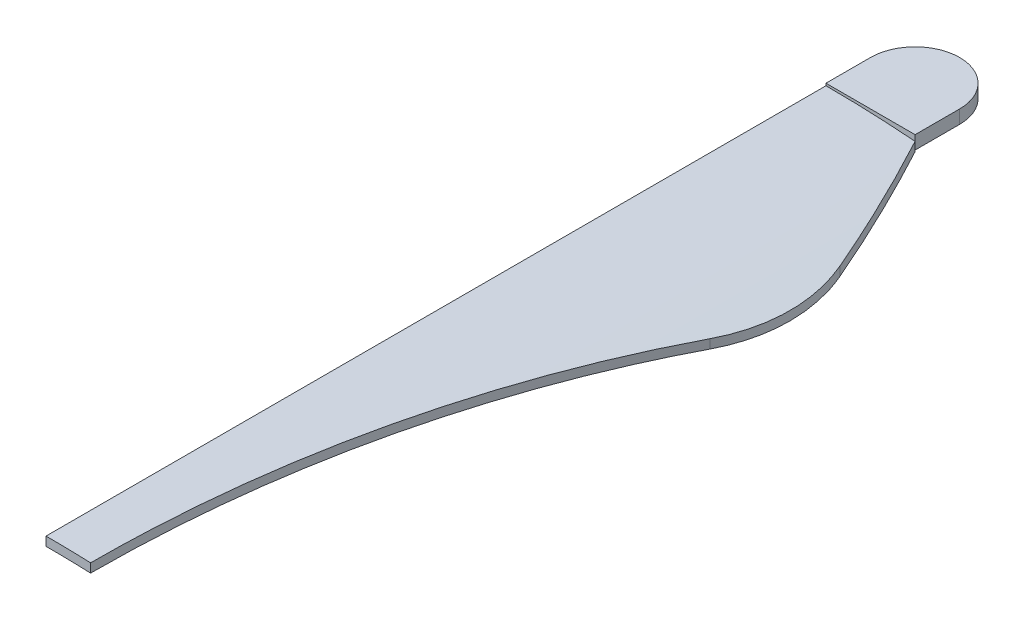
ISO-10303-21;
HEADER;
FILE_DESCRIPTION(('STEP AP214'),'2;1');
FILE_NAME('part.step','',(''),(''),'','','');
FILE_SCHEMA(('AUTOMOTIVE_DESIGN { 1 0 10303 214 1 1 1 1 }'));
ENDSEC;
DATA;
#1=APPLICATION_CONTEXT('core data for automotive mechanical design processes');
#2=APPLICATION_PROTOCOL_DEFINITION('international standard','automotive_design',2000,#1);
#3=PRODUCT_CONTEXT('',#1,'mechanical');
#4=PRODUCT('Part','Part','',(#3));
#5=PRODUCT_RELATED_PRODUCT_CATEGORY('part','',(#4));
#6=PRODUCT_DEFINITION_FORMATION('','',#4);
#7=PRODUCT_DEFINITION_CONTEXT('part definition',#1,'design');
#8=PRODUCT_DEFINITION('design','',#6,#7);
#9=PRODUCT_DEFINITION_SHAPE('','',#8);
#10=(LENGTH_UNIT() NAMED_UNIT(*) SI_UNIT(.MILLI.,.METRE.));
#11=(NAMED_UNIT(*) PLANE_ANGLE_UNIT() SI_UNIT($,.RADIAN.));
#12=(NAMED_UNIT(*) SI_UNIT($,.STERADIAN.) SOLID_ANGLE_UNIT());
#13=UNCERTAINTY_MEASURE_WITH_UNIT(LENGTH_MEASURE(1.E-05),#10,'distance_accuracy_value','');
#14=(GEOMETRIC_REPRESENTATION_CONTEXT(3) GLOBAL_UNCERTAINTY_ASSIGNED_CONTEXT((#13)) GLOBAL_UNIT_ASSIGNED_CONTEXT((#10,
#11,#12)) REPRESENTATION_CONTEXT('',''));
#15=CARTESIAN_POINT('',(0.,0.,0.));
#16=DIRECTION('',(0.,0.,1.));
#17=DIRECTION('',(1.,0.,0.));
#18=AXIS2_PLACEMENT_3D('',#15,#16,#17);
#19=CARTESIAN_POINT('',(0.,-500.,0.));
#20=DIRECTION('',(0.,0.,-1.));
#21=DIRECTION('',(-1.,0.,0.));
#22=AXIS2_PLACEMENT_3D('',#19,#20,#21);
#23=PLANE('',#22);
#24=DIRECTION('',(1.,0.,0.));
#25=VECTOR('',#24,1.);
#26=CARTESIAN_POINT('',(40.,-5.,0.));
#27=LINE('',#26,#25);
#28=CARTESIAN_POINT('',(31.4801524773943,-5.,0.));
#29=VERTEX_POINT('',#28);
#30=CARTESIAN_POINT('',(40.,-5.,0.));
#31=VERTEX_POINT('',#30);
#32=EDGE_CURVE('E146',#29,#31,#27,.T.);
#33=ORIENTED_EDGE('',*,*,#32,.T.);
#34=DIRECTION('',(0.,1.,0.));
#35=VECTOR('',#34,1.);
#36=CARTESIAN_POINT('',(40.,-10.4941266950926,0.));
#37=LINE('',#36,#35);
#38=CARTESIAN_POINT('',(40.,-5.61553422462802,0.));
#39=VERTEX_POINT('',#38);
#40=EDGE_CURVE('E61',#39,#31,#37,.T.);
#41=ORIENTED_EDGE('',*,*,#40,.F.);
#42=CARTESIAN_POINT('',(0.,-500.,0.));
#43=DIRECTION('',(0.,0.,-1.));
#44=DIRECTION('',(-1.,0.,0.));
#45=AXIS2_PLACEMENT_3D('',#42,#43,#44);
#46=CIRCLE('',#45,496.);
#47=EDGE_CURVE('E225',#29,#39,#46,.T.);
#48=ORIENTED_EDGE('',*,*,#47,.F.);
#49=EDGE_LOOP('',(#33,#41,#48));
#50=FACE_BOUND('',#49,.T.);
#51=ADVANCED_FACE('F40',(#50),#23,.T.);
#52=CARTESIAN_POINT('',(0.,-500.,350.));
#53=DIRECTION('',(0.,0.,-1.));
#54=DIRECTION('',(-1.,0.,0.));
#55=AXIS2_PLACEMENT_3D('',#52,#53,#54);
#56=CYLINDRICAL_SURFACE('',#55,500.);
#57=CARTESIAN_POINT('',(39.9999999999999,-1.60256822491556,0.));
#58=CARTESIAN_POINT('',(42.6357460425873,-1.81413813341256,5.06786090540559));
#59=CARTESIAN_POINT('',(45.2073257510757,-2.04153684561505,10.1683974444305));
#60=CARTESIAN_POINT('',(50.2191020421145,-2.52197755026612,20.4283459968078));
#61=CARTESIAN_POINT('',(52.6593822932445,-2.77500290894377,25.5877179154173));
#62=CARTESIAN_POINT('',(57.4089084844292,-3.30097013261121,35.9653974094959));
#63=CARTESIAN_POINT('',(59.7181546634356,-3.57391196127955,41.1837048774701));
#64=CARTESIAN_POINT('',(64.2057660714829,-4.13436588078955,51.6795187009418));
#65=CARTESIAN_POINT('',(66.3840458721034,-4.42188726115771,56.9570610881777));
#66=CARTESIAN_POINT('',(68.4954251698396,-4.71384359059367,62.2609771605887));
#67=B_SPLINE_CURVE_WITH_KNOTS('',3,(#57,#58,#59,#60,#61,#62,#63,#64,#65,#66),.UNSPECIFIED.,.F.,
.F.,(4,2,2,2,4),(0.,17.1481298217255,34.2851995945112,51.4222381153875,68.570336363611),.UNSPECIFIED.);
#68=CARTESIAN_POINT('',(40.,-1.60256822491551,0.));
#69=VERTEX_POINT('',#68);
#70=CARTESIAN_POINT('',(68.4954251698395,-4.71384359059368,62.2609771605888));
#71=VERTEX_POINT('',#70);
#72=EDGE_CURVE('E255',#69,#71,#67,.T.);
#73=ORIENTED_EDGE('',*,*,#72,.F.);
#74=CARTESIAN_POINT('',(0.,-500.,0.));
#75=DIRECTION('',(0.,0.,1.));
#76=DIRECTION('',(-1.,0.,0.));
#77=AXIS2_PLACEMENT_3D('',#74,#75,#76);
#78=CIRCLE('',#77,500.);
#79=CARTESIAN_POINT('',(0.,0.,0.));
#80=VERTEX_POINT('',#79);
#81=EDGE_CURVE('E144',#69,#80,#78,.T.);
#82=ORIENTED_EDGE('',*,*,#81,.T.);
#83=DIRECTION('',(0.,0.,-1.));
#84=VECTOR('',#83,1.);
#85=CARTESIAN_POINT('',(0.,0.,350.));
#86=LINE('',#85,#84);
#87=CARTESIAN_POINT('',(0.,0.,350.));
#88=VERTEX_POINT('',#87);
#89=EDGE_CURVE('E134',#88,#80,#86,.T.);
#90=ORIENTED_EDGE('',*,*,#89,.F.);
#91=CARTESIAN_POINT('',(0.,-500.,350.));
#92=DIRECTION('',(0.,0.,1.));
#93=DIRECTION('',(-1.,0.,0.));
#94=AXIS2_PLACEMENT_3D('',#91,#92,#93);
#95=CIRCLE('',#94,500.);
#96=CARTESIAN_POINT('',(20.,-0.400160128128216,350.));
#97=VERTEX_POINT('',#96);
#98=EDGE_CURVE('E118',#97,#88,#95,.T.);
#99=ORIENTED_EDGE('',*,*,#98,.F.);
#100=CARTESIAN_POINT('',(67.6518018777058,-4.5979070465087,119.770992366412));
#101=CARTESIAN_POINT('',(66.0370849459635,-4.37742049336618,123.504605553351));
#102=CARTESIAN_POINT('',(64.461386299886,-4.17026808924305,127.255855869261));
#103=CARTESIAN_POINT('',(61.3888563629122,-3.7804809047113,134.7917508133));
#104=CARTESIAN_POINT('',(59.8920245027497,-3.59784594731921,138.576395200159));
#105=CARTESIAN_POINT('',(56.9780745232113,-3.25494444282596,146.177150731898));
#106=CARTESIAN_POINT('',(55.5609542745152,-3.09467729804834,149.993261033112));
#107=CARTESIAN_POINT('',(52.8071465339527,-2.79448646327352,157.655115206395));
#108=CARTESIAN_POINT('',(51.470459187741,-2.65456281011532,161.500859132114));
#109=CARTESIAN_POINT('',(47.580958186373,-2.26226145087469,173.08319772298));
#110=CARTESIAN_POINT('',(45.1498118950002,-2.03748042025413,180.862013594122));
#111=CARTESIAN_POINT('',(40.6172071547249,-1.6472991581043,196.516127006125));
#112=CARTESIAN_POINT('',(38.5157467448533,-1.48189857337307,204.391423972816));
#113=CARTESIAN_POINT('',(34.6790029361022,-1.20043408606813,220.090977557488));
#114=CARTESIAN_POINT('',(32.93813497451,-1.08358417173421,227.913850138908));
#115=CARTESIAN_POINT('',(30.5710393587079,-0.934842649461949,239.697165520769));
#116=CARTESIAN_POINT('',(29.8226778062668,-0.889682801753163,243.633299450563));
#117=CARTESIAN_POINT('',(28.407666924401,-0.807143331468977,251.520284163316));
#118=CARTESIAN_POINT('',(27.7410157127766,-0.769763529666169,255.471134605118));
#119=CARTESIAN_POINT('',(26.4900799146696,-0.701825123115239,263.383570734695));
#120=CARTESIAN_POINT('',(25.9057483212698,-0.671262619625212,267.345148968435));
#121=CARTESIAN_POINT('',(24.8192616002311,-0.616079320780989,275.27951249314));
#122=CARTESIAN_POINT('',(24.317104598798,-0.591458389937422,279.252297526459));
#123=CARTESIAN_POINT('',(23.3952252503751,-0.547423345613465,287.206977529526));
#124=CARTESIAN_POINT('',(22.9754933240406,-0.528008626977275,291.188871386176));
#125=CARTESIAN_POINT('',(22.2185823317236,-0.493765621521082,299.160423648141));
#126=CARTESIAN_POINT('',(21.8814011913826,-0.478937219452401,303.15008185581));
#127=CARTESIAN_POINT('',(21.3219070130397,-0.454761056567123,310.701189281939));
#128=CARTESIAN_POINT('',(21.0910885794551,-0.444992580773984,314.262009756518));
#129=CARTESIAN_POINT('',(20.695234245587,-0.428437246506293,321.386781978632));
#130=CARTESIAN_POINT('',(20.530188482962,-0.421649941001909,324.950733176346));
#131=CARTESIAN_POINT('',(20.2653844701422,-0.410835956903092,332.094680365448));
#132=CARTESIAN_POINT('',(20.1658777242074,-0.406819910164284,335.674685692101));
#133=CARTESIAN_POINT('',(20.0331785107647,-0.401488832846971,342.836460396845));
#134=CARTESIAN_POINT('',(19.9999959191106,-0.400174204516471,346.418229958226));
#135=CARTESIAN_POINT('',(19.9999999999999,-0.400160128128171,350.));
#136=B_SPLINE_CURVE_WITH_KNOTS('',3,(#100,#101,#102,#103,#104,#105,#106,#107,#108,#109,#110,
#111,#112,#113,#114,#115,#116,#117,#118,#119,#120,#121,#122,#123,#124,#125,#126,#127,#128,#129,
#130,#131,#132,#133,#134,#135),.UNSPECIFIED.,.F.,.F.,(4,2,2,2,2,2,2,2,2,2,2,2,2,2,2,2,2,4),(0.,
12.2210952857972,24.4421023467491,36.6627827952017,48.8834853731911,73.3341618966582,
97.7846929821792,121.822310836496,133.842299678847,145.862011588393,157.874831825094,
169.887378100107,181.898527463912,193.909374977305,204.613700538205,215.316420425026,
226.059976059254,236.805131320087),.UNSPECIFIED.);
#137=CARTESIAN_POINT('',(67.6518018777056,-4.59790704650864,119.770992366412));
#138=VERTEX_POINT('',#137);
#139=EDGE_CURVE('E186',#138,#97,#136,.T.);
#140=ORIENTED_EDGE('',*,*,#139,.F.);
#141=CARTESIAN_POINT('',(68.4954251698395,-4.71384359059368,62.2609771605888));
#142=CARTESIAN_POINT('',(68.8813526547042,-4.76721986651159,63.2304078278076));
#143=CARTESIAN_POINT('',(69.2470690441918,-4.81825182775029,64.2080150537457));
#144=CARTESIAN_POINT('',(69.9374691789008,-4.91528690050184,66.1778617309593));
#145=CARTESIAN_POINT('',(70.2621527953763,-4.96128999623586,67.1701012281349));
#146=CARTESIAN_POINT('',(70.8698816640133,-5.04792779953621,69.1675089928595));
#147=CARTESIAN_POINT('',(71.1529259344575,-5.0885623805285,70.1726775646259));
#148=CARTESIAN_POINT('',(71.6768459723733,-5.16416873864837,72.1941535478737));
#149=CARTESIAN_POINT('',(71.9177218423888,-5.19914052954655,73.2104609322617));
#150=CARTESIAN_POINT('',(72.3569522997522,-5.26318034894725,75.2528772653591));
#151=CARTESIAN_POINT('',(72.555288099848,-5.29224576868342,76.2789903365136));
#152=CARTESIAN_POINT('',(72.9089481217826,-5.34424369514204,78.3388549608326));
#153=CARTESIAN_POINT('',(73.0642683514128,-5.36717563261874,79.372607213843));
#154=CARTESIAN_POINT('',(73.3315593594778,-5.40673209575221,81.4456635497993));
#155=CARTESIAN_POINT('',(73.4435366406308,-5.423357567557,82.4849667761976));
#156=CARTESIAN_POINT('',(73.6239704957875,-5.45018522654888,84.5675189428526));
#157=CARTESIAN_POINT('',(73.6924232517163,-5.46038685021998,85.6107682211935));
#158=CARTESIAN_POINT('',(73.7856985657591,-5.47429499066302,87.7000708618577));
#159=CARTESIAN_POINT('',(73.8104871977141,-5.47799645693472,88.746125772686));
#160=CARTESIAN_POINT('',(73.8162829135154,-5.47886153836405,90.8383596058836));
#161=CARTESIAN_POINT('',(73.7972899943799,-5.47602515307641,91.8845385282613));
#162=CARTESIAN_POINT('',(73.7155516693965,-5.4638343376138,93.9753314229862));
#163=CARTESIAN_POINT('',(73.6527985887629,-5.45447876408466,95.0199450886031));
#164=CARTESIAN_POINT('',(73.4836586995042,-5.429318286706,97.1054632869783));
#165=CARTESIAN_POINT('',(73.377275733497,-5.41351395081942,98.1463681382419));
#166=CARTESIAN_POINT('',(73.121290701173,-5.37560356119604,100.220983772967));
#167=CARTESIAN_POINT('',(72.9717604537734,-5.35350798007919,101.254703611539));
#168=CARTESIAN_POINT('',(72.6297100845391,-5.3031685082672,103.314756186561));
#169=CARTESIAN_POINT('',(72.4371940190229,-5.27492519770341,104.341089610597));
#170=CARTESIAN_POINT('',(72.009603113883,-5.21250651487484,106.384285206702));
#171=CARTESIAN_POINT('',(71.7745433343552,-5.17833324193993,107.401150596868));
#172=CARTESIAN_POINT('',(71.2622801055465,-5.10429945554509,109.423891972996));
#173=CARTESIAN_POINT('',(70.9850816945158,-5.06443962202634,110.429769257348));
#174=CARTESIAN_POINT('',(70.475355039167,-4.99164655656949,112.139386764415));
#175=CARTESIAN_POINT('',(70.2531334333658,-4.96004965418397,112.846276908397));
#176=CARTESIAN_POINT('',(69.7879296332485,-4.89425366517972,114.252906557665));
#177=CARTESIAN_POINT('',(69.544952061989,-4.86005515821123,114.952647616622));
#178=CARTESIAN_POINT('',(69.0387626899559,-4.78922211498776,116.343570589964));
#179=CARTESIAN_POINT('',(68.7755786954614,-4.75259093541692,117.034762798996));
#180=CARTESIAN_POINT('',(68.2288737961155,-4.67697744582368,118.409101426766));
#181=CARTESIAN_POINT('',(67.9453484844614,-4.63799462662807,119.092246064506));
#182=CARTESIAN_POINT('',(67.6518018777057,-4.5979070465086,119.770992366412));
#183=B_SPLINE_CURVE_WITH_KNOTS('',3,(#141,#142,#143,#144,#145,#146,#147,#148,#149,#150,#151,
#152,#153,#154,#155,#156,#157,#158,#159,#160,#161,#162,#163,#164,#165,#166,#167,#168,#169,#170,
#171,#172,#173,#174,#175,#176,#177,#178,#179,#180,#181,#182),.UNSPECIFIED.,.F.,.F.,(4,2,2,2,2,2,
2,2,2,2,2,2,2,2,2,2,2,2,2,2,4),(0.,3.13414092176516,6.26829167708911,9.40251631343516,
12.5367333279561,15.6723316902393,18.8082209651081,21.9436395817416,25.0793332068177,
28.2174621307829,31.3555912684714,34.4942709189253,37.6326741955649,40.7658834204964,
43.8987971077807,47.0306039329196,50.1620366017688,52.3867415464265,54.6109522595349,
56.8321552583403,59.053840926699),.UNSPECIFIED.);
#184=EDGE_CURVE('E85',#71,#138,#183,.T.);
#185=ORIENTED_EDGE('',*,*,#184,.F.);
#186=EDGE_LOOP('',(#73,#82,#90,#99,#140,#185));
#187=FACE_BOUND('',#186,.T.);
#188=ADVANCED_FACE('F42',(#187),#56,.T.);
#189=CARTESIAN_POINT('',(0.,-500.,350.));
#190=DIRECTION('',(0.,0.,-1.));
#191=DIRECTION('',(-1.,0.,0.));
#192=AXIS2_PLACEMENT_3D('',#189,#190,#191);
#193=CYLINDRICAL_SURFACE('',#192,496.);
#194=CARTESIAN_POINT('',(68.4954251698395,-8.75222470651033,62.2609771605887));
#195=CARTESIAN_POINT('',(66.3840552169472,-8.45786953680281,56.9570847359306));
#196=CARTESIAN_POINT('',(64.2057839222447,-8.16798997181662,51.6795618166731));
#197=CARTESIAN_POINT('',(59.7181859248119,-7.60294639974288,41.1837766282945));
#198=CARTESIAN_POINT('',(57.4089446782788,-7.32777301965596,35.9654783240952));
#199=CARTESIAN_POINT('',(52.6594219702867,-6.79751147977523,25.5878027781962));
#200=CARTESIAN_POINT('',(50.2191402659362,-6.54242335721284,20.4284256457319));
#201=CARTESIAN_POINT('',(45.2073520786617,-6.05807059060418,10.1684499419972));
#202=CARTESIAN_POINT('',(42.635761896933,-5.82882272394352,5.06789146715783));
#203=CARTESIAN_POINT('',(39.9999999999999,-5.61553422462799,0.));
#204=B_SPLINE_CURVE_WITH_KNOTS('',3,(#194,#195,#196,#197,#198,#199,#200,#201,#202,#203),
.UNSPECIFIED.,.F.,.F.,(4,2,2,2,4),(0.,17.1483914681556,34.2857197586618,51.4230798153479,
68.5715033764119),.UNSPECIFIED.);
#205=CARTESIAN_POINT('',(68.4954251698395,-8.75222470651033,62.2609771605888));
#206=VERTEX_POINT('',#205);
#207=EDGE_CURVE('E236',#206,#39,#204,.T.);
#208=ORIENTED_EDGE('',*,*,#207,.F.);
#209=CARTESIAN_POINT('',(67.6518018777057,-8.63533531327299,119.770992366412));
#210=CARTESIAN_POINT('',(68.0660280862278,-8.69237088828384,118.813230429485));
#211=CARTESIAN_POINT('',(68.4602897956822,-8.74718303744311,117.846699927438));
#212=CARTESIAN_POINT('',(69.2082240563466,-8.85199230196143,115.897799328753));
#213=CARTESIAN_POINT('',(69.561896464947,-8.90198940040279,114.915429176476));
#214=CARTESIAN_POINT('',(70.2279986221066,-8.9968013387929,112.936525111016));
#215=CARTESIAN_POINT('',(70.5404271842519,-9.04161602966074,111.939990791303));
#216=CARTESIAN_POINT('',(71.1234563667044,-9.12573830343804,109.934532978658));
#217=CARTESIAN_POINT('',(71.3940570917175,-9.16504590013315,108.925609516747));
#218=CARTESIAN_POINT('',(71.8930502473569,-9.23788560872386,106.896643571432));
#219=CARTESIAN_POINT('',(72.1214218286755,-9.27141486719455,105.876595857565));
#220=CARTESIAN_POINT('',(72.5353836343997,-9.33243238243747,103.827577895646));
#221=CARTESIAN_POINT('',(72.7209698913145,-9.35992007896354,102.798606829303));
#222=CARTESIAN_POINT('',(73.0489591345837,-9.40864555201281,100.733817226693));
#223=CARTESIAN_POINT('',(73.1913686459245,-9.42988427288372,99.6979997492726));
#224=CARTESIAN_POINT('',(73.4327831156415,-9.46596319273566,97.6211156935224));
#225=CARTESIAN_POINT('',(73.5317842681909,-9.48080283067537,96.5800486630283));
#226=CARTESIAN_POINT('',(73.6862378825377,-9.50398120474133,94.4937716303521));
#227=CARTESIAN_POINT('',(73.7416551343486,-9.51231468471894,93.4485589626888));
#228=CARTESIAN_POINT('',(73.8087023995853,-9.52239949135658,91.356698445093));
#229=CARTESIAN_POINT('',(73.8203324153981,-9.52415081837541,90.3100505952386));
#230=CARTESIAN_POINT('',(73.7997811997362,-9.52105814573155,88.2170104064946));
#231=CARTESIAN_POINT('',(73.7675922468054,-9.51621298368412,87.1706181451429));
#232=CARTESIAN_POINT('',(73.659455686144,-9.49996169717268,85.0802408017477));
#233=CARTESIAN_POINT('',(73.5835119409854,-9.48855615184431,84.0362555153886));
#234=CARTESIAN_POINT('',(73.3881778146188,-9.4592931393206,81.9542163743752));
#235=CARTESIAN_POINT('',(73.2688605276595,-9.44144652714281,80.9161555075914));
#236=CARTESIAN_POINT('',(72.987000450166,-9.39943124566292,78.8461464355644));
#237=CARTESIAN_POINT('',(72.8244617485594,-9.37526317440099,77.8141976615272));
#238=CARTESIAN_POINT('',(72.4565277409362,-9.3207909995887,75.758516206981));
#239=CARTESIAN_POINT('',(72.251147654765,-9.29048907526596,74.734780742376));
#240=CARTESIAN_POINT('',(71.7979008352209,-9.22396766435182,72.697061053891));
#241=CARTESIAN_POINT('',(71.5500391996474,-9.18774888780897,71.6830756753985));
#242=CARTESIAN_POINT('',(71.0905391139579,-9.12102076126811,69.95998921043));
#243=CARTESIAN_POINT('',(70.889347242632,-9.09191677626833,69.2480277462695));
#244=CARTESIAN_POINT('',(70.4660674183763,-9.03097953609392,67.8306236043924));
#245=CARTESIAN_POINT('',(70.2439841220493,-8.99914688926525,67.1251795123009));
#246=CARTESIAN_POINT('',(69.7794025268069,-8.93290678965715,65.7222224633375));
#247=CARTESIAN_POINT('',(69.5369319882523,-8.8985028449708,65.0247001438631));
#248=CARTESIAN_POINT('',(69.0314904429164,-8.82720129627032,63.6370795180178));
#249=CARTESIAN_POINT('',(68.7685149881156,-8.79030315143528,62.9469828596087));
#250=CARTESIAN_POINT('',(68.4954251698395,-8.75222470651033,62.2609771605888));
#251=B_SPLINE_CURVE_WITH_KNOTS('',3,(#209,#210,#211,#212,#213,#214,#215,#216,#217,#218,#219,
#220,#221,#222,#223,#224,#225,#226,#227,#228,#229,#230,#231,#232,#233,#234,#235,#236,#237,#238,
#239,#240,#241,#242,#243,#244,#245,#246,#247,#248,#249,#250),.UNSPECIFIED.,.F.,.F.,(4,2,2,2,2,2,
2,2,2,2,2,2,2,2,2,2,2,2,2,2,4),(0.,3.13494445450442,6.26989992323257,9.40494555194415,
12.5399833326948,15.6765648307237,18.8134370676469,21.949835015417,25.0865078918364,
28.2257121866044,31.3649163102504,34.5046736729392,37.6441539075563,40.7783677495334,
43.9122851871222,47.0450911584936,50.1775214550271,52.3984622459438,54.6189091670677,
56.8363801096937,59.0543334216239),.UNSPECIFIED.);
#252=CARTESIAN_POINT('',(67.6518018777056,-8.63533531327299,119.770992366412));
#253=VERTEX_POINT('',#252);
#254=EDGE_CURVE('E12',#253,#206,#251,.T.);
#255=ORIENTED_EDGE('',*,*,#254,.F.);
#256=CARTESIAN_POINT('',(19.9999999999999,-4.40338984210159,350.));
#257=CARTESIAN_POINT('',(19.9999931222747,-4.40341358104365,345.927254926515));
#258=CARTESIAN_POINT('',(20.0428978199603,-4.40512185640619,341.854510015596));
#259=CARTESIAN_POINT('',(20.2144809911542,-4.41207792394427,333.710830217315));
#260=CARTESIAN_POINT('',(20.3431594687647,-4.41732571628911,329.639895330038));
#261=CARTESIAN_POINT('',(20.6862439164387,-4.43153138980584,321.501572330474));
#262=CARTESIAN_POINT('',(20.9006514315075,-4.44048933784212,317.434184283432));
#263=CARTESIAN_POINT('',(21.4150957377886,-4.46245308328224,309.304838738266));
#264=CARTESIAN_POINT('',(21.7151325184348,-4.4754588801866,305.242881239473));
#265=CARTESIAN_POINT('',(22.4009393280387,-4.50598821338195,297.12339177899));
#266=CARTESIAN_POINT('',(22.7867685975526,-4.52351487271761,293.065864831591));
#267=CARTESIAN_POINT('',(23.6438765914861,-4.56367605308017,284.959778678856));
#268=CARTESIAN_POINT('',(24.1151573451364,-4.58631069541033,280.911219688795));
#269=CARTESIAN_POINT('',(25.1429331427623,-4.63740753266319,272.825122171125));
#270=CARTESIAN_POINT('',(25.6994246343382,-4.66586948466447,268.787583191235));
#271=CARTESIAN_POINT('',(26.8973791352995,-4.72947868234976,260.725158397974));
#272=CARTESIAN_POINT('',(27.5388440668445,-4.76462607927113,256.700272872942));
#273=CARTESIAN_POINT('',(29.5668037394592,-4.88018851165889,244.785299617359));
#274=CARTESIAN_POINT('',(31.0746220263441,-4.97154377144533,236.915598209909));
#275=CARTESIAN_POINT('',(34.414861185086,-5.19254680291988,221.245845524613));
#276=CARTESIAN_POINT('',(36.2472944735246,-5.32219603948606,213.445796922992));
#277=CARTESIAN_POINT('',(40.2320559148726,-5.63032837297184,197.934470685426));
#278=CARTESIAN_POINT('',(42.384165526566,-5.8087781777734,190.22313625187));
#279=CARTESIAN_POINT('',(47.0049736604271,-6.22685920822124,174.898503970235));
#280=CARTESIAN_POINT('',(49.473625000936,-6.46648132118361,167.285191697332));
#281=CARTESIAN_POINT('',(53.2687880215746,-6.86734234543795,156.356715561368));
#282=CARTESIAN_POINT('',(54.4705230943845,-6.99847891096966,152.996644073231));
#283=CARTESIAN_POINT('',(56.9354176398208,-7.27705838705353,146.300256198508));
#284=CARTESIAN_POINT('',(58.1985685100471,-7.42449901759035,142.963936559666));
#285=CARTESIAN_POINT('',(60.790925390483,-7.7376968895534,136.303029447277));
#286=CARTESIAN_POINT('',(62.1203682326848,-7.90352284367188,132.97853742282));
#287=CARTESIAN_POINT('',(64.8404015981673,-8.25453714595387,126.355136976109));
#288=CARTESIAN_POINT('',(66.2310008490522,-8.43972826294071,123.056232284953));
#289=CARTESIAN_POINT('',(67.6518018777057,-8.63533531327301,119.770992366412));
#290=B_SPLINE_CURVE_WITH_KNOTS('',3,(#256,#257,#258,#259,#260,#261,#262,#263,#264,#265,#266,
#267,#268,#269,#270,#271,#272,#273,#274,#275,#276,#277,#278,#279,#280,#281,#282,#283,#284,#285,
#286,#287,#288,#289),.UNSPECIFIED.,.F.,.F.,(4,2,2,2,2,2,2,2,2,2,2,2,2,2,2,2,4),(0.,
12.2180086434436,24.4360178712404,36.6542473014361,48.8724752239838,61.0991662981094,
73.3261477595758,85.5526196220611,97.7793681032786,121.811918484088,145.845388312793,
169.862503052391,193.876042108814,204.58829081323,215.29904337067,226.051268748675,
236.805033583146),.UNSPECIFIED.);
#291=CARTESIAN_POINT('',(20.,-4.40338984210159,350.));
#292=VERTEX_POINT('',#291);
#293=EDGE_CURVE('E384',#292,#253,#290,.T.);
#294=ORIENTED_EDGE('',*,*,#293,.F.);
#295=CARTESIAN_POINT('',(0.,-500.,350.));
#296=DIRECTION('',(0.,0.,-1.));
#297=DIRECTION('',(-1.,0.,0.));
#298=AXIS2_PLACEMENT_3D('',#295,#296,#297);
#299=CIRCLE('',#298,496.);
#300=CARTESIAN_POINT('',(0.,-4.,350.));
#301=VERTEX_POINT('',#300);
#302=EDGE_CURVE('E140',#301,#292,#299,.T.);
#303=ORIENTED_EDGE('',*,*,#302,.F.);
#304=DIRECTION('',(0.,0.,-1.));
#305=VECTOR('',#304,1.);
#306=CARTESIAN_POINT('',(0.,-4.,350.));
#307=LINE('',#306,#305);
#308=CARTESIAN_POINT('',(0.,-4.,0.));
#309=VERTEX_POINT('',#308);
#310=EDGE_CURVE('E137',#301,#309,#307,.T.);
#311=ORIENTED_EDGE('',*,*,#310,.T.);
#312=EDGE_CURVE('E129',#309,#29,#46,.T.);
#313=ORIENTED_EDGE('',*,*,#312,.T.);
#314=ORIENTED_EDGE('',*,*,#47,.T.);
#315=EDGE_LOOP('',(#208,#255,#294,#303,#311,#313,#314));
#316=FACE_BOUND('',#315,.T.);
#317=ADVANCED_FACE('F166',(#316),#193,.F.);
#318=CARTESIAN_POINT('',(0.,-500.,350.));
#319=DIRECTION('',(0.,0.,-1.));
#320=DIRECTION('',(-1.,0.,0.));
#321=AXIS2_PLACEMENT_3D('',#318,#319,#320);
#322=PLANE('',#321);
#323=DIRECTION('',(0.,1.,0.));
#324=VECTOR('',#323,1.);
#325=CARTESIAN_POINT('',(20.,-10.4941266950926,350.));
#326=LINE('',#325,#324);
#327=EDGE_CURVE('E52',#97,#292,#326,.F.);
#328=ORIENTED_EDGE('',*,*,#327,.F.);
#329=ORIENTED_EDGE('',*,*,#98,.T.);
#330=DIRECTION('',(0.,-1.,0.));
#331=VECTOR('',#330,1.);
#332=CARTESIAN_POINT('',(0.,-4.,350.));
#333=LINE('',#332,#331);
#334=EDGE_CURVE('E122',#88,#301,#333,.T.);
#335=ORIENTED_EDGE('',*,*,#334,.T.);
#336=ORIENTED_EDGE('',*,*,#302,.T.);
#337=EDGE_LOOP('',(#328,#329,#335,#336));
#338=FACE_BOUND('',#337,.T.);
#339=ADVANCED_FACE('F120',(#338),#322,.F.);
#340=CARTESIAN_POINT('',(0.,-4.,350.));
#341=DIRECTION('',(1.,0.,0.));
#342=DIRECTION('',(0.,1.,0.));
#343=AXIS2_PLACEMENT_3D('',#340,#341,#342);
#344=PLANE('',#343);
#345=ORIENTED_EDGE('',*,*,#89,.T.);
#346=DIRECTION('',(0.,1.,0.));
#347=VECTOR('',#346,1.);
#348=CARTESIAN_POINT('',(0.,-5.,0.));
#349=LINE('',#348,#347);
#350=CARTESIAN_POINT('',(0.,1.,0.));
#351=VERTEX_POINT('',#350);
#352=EDGE_CURVE('E214',#80,#351,#349,.T.);
#353=ORIENTED_EDGE('',*,*,#352,.T.);
#354=DIRECTION('',(0.,0.,1.));
#355=VECTOR('',#354,1.);
#356=CARTESIAN_POINT('',(0.,1.,0.));
#357=LINE('',#356,#355);
#358=CARTESIAN_POINT('',(0.,1.,-20.));
#359=VERTEX_POINT('',#358);
#360=EDGE_CURVE('E192',#359,#351,#357,.T.);
#361=ORIENTED_EDGE('',*,*,#360,.F.);
#362=DIRECTION('',(0.,1.,0.));
#363=VECTOR('',#362,1.);
#364=CARTESIAN_POINT('',(0.,-5.,-20.));
#365=LINE('',#364,#363);
#366=CARTESIAN_POINT('',(0.,-5.,-20.));
#367=VERTEX_POINT('',#366);
#368=EDGE_CURVE('E215',#367,#359,#365,.T.);
#369=ORIENTED_EDGE('',*,*,#368,.F.);
#370=DIRECTION('',(0.,0.,1.));
#371=VECTOR('',#370,1.);
#372=CARTESIAN_POINT('',(0.,-5.,0.));
#373=LINE('',#372,#371);
#374=CARTESIAN_POINT('',(0.,-5.,0.));
#375=VERTEX_POINT('',#374);
#376=EDGE_CURVE('E207',#367,#375,#373,.T.);
#377=ORIENTED_EDGE('',*,*,#376,.T.);
#378=EDGE_CURVE('E211',#375,#309,#349,.T.);
#379=ORIENTED_EDGE('',*,*,#378,.T.);
#380=ORIENTED_EDGE('',*,*,#310,.F.);
#381=ORIENTED_EDGE('',*,*,#334,.F.);
#382=EDGE_LOOP('',(#345,#353,#361,#369,#377,#379,#380,#381));
#383=FACE_BOUND('',#382,.T.);
#384=ADVANCED_FACE('F133',(#383),#344,.F.);
#385=CARTESIAN_POINT('',(40.,-5.,0.));
#386=DIRECTION('',(0.,0.,1.));
#387=DIRECTION('',(1.,0.,0.));
#388=AXIS2_PLACEMENT_3D('',#385,#386,#387);
#389=PLANE('',#388);
#390=ORIENTED_EDGE('',*,*,#81,.F.);
#391=DIRECTION('',(0.,1.,0.));
#392=VECTOR('',#391,1.);
#393=CARTESIAN_POINT('',(40.,-5.,0.));
#394=LINE('',#393,#392);
#395=CARTESIAN_POINT('',(40.,1.,0.));
#396=VERTEX_POINT('',#395);
#397=EDGE_CURVE('E74',#69,#396,#394,.T.);
#398=ORIENTED_EDGE('',*,*,#397,.T.);
#399=DIRECTION('',(1.,0.,0.));
#400=VECTOR('',#399,1.);
#401=CARTESIAN_POINT('',(40.,1.,0.));
#402=LINE('',#401,#400);
#403=EDGE_CURVE('E164',#351,#396,#402,.T.);
#404=ORIENTED_EDGE('',*,*,#403,.F.);
#405=ORIENTED_EDGE('',*,*,#352,.F.);
#406=EDGE_LOOP('',(#390,#398,#404,#405));
#407=FACE_BOUND('',#406,.T.);
#408=ADVANCED_FACE('F281',(#407),#389,.T.);
#409=ORIENTED_EDGE('',*,*,#312,.F.);
#410=ORIENTED_EDGE('',*,*,#378,.F.);
#411=EDGE_CURVE('E152',#375,#29,#27,.T.);
#412=ORIENTED_EDGE('',*,*,#411,.T.);
#413=EDGE_LOOP('',(#409,#410,#412));
#414=FACE_BOUND('',#413,.T.);
#415=ADVANCED_FACE('F276',(#414),#389,.T.);
#416=CARTESIAN_POINT('',(20.,-5.,-20.));
#417=DIRECTION('',(0.,1.,0.));
#418=DIRECTION('',(0.,0.,1.));
#419=AXIS2_PLACEMENT_3D('',#416,#417,#418);
#420=CYLINDRICAL_SURFACE('',#419,20.);
#421=ORIENTED_EDGE('',*,*,#368,.T.);
#422=CARTESIAN_POINT('',(20.,1.,-20.));
#423=DIRECTION('',(0.,1.,0.));
#424=DIRECTION('',(0.,0.,1.));
#425=AXIS2_PLACEMENT_3D('',#422,#423,#424);
#426=CIRCLE('',#425,20.);
#427=CARTESIAN_POINT('',(40.,1.,-20.));
#428=VERTEX_POINT('',#427);
#429=EDGE_CURVE('E195',#428,#359,#426,.T.);
#430=ORIENTED_EDGE('',*,*,#429,.F.);
#431=DIRECTION('',(0.,1.,0.));
#432=VECTOR('',#431,1.);
#433=CARTESIAN_POINT('',(40.,-5.,-20.));
#434=LINE('',#433,#432);
#435=CARTESIAN_POINT('',(40.,-5.,-20.));
#436=VERTEX_POINT('',#435);
#437=EDGE_CURVE('E218',#436,#428,#434,.T.);
#438=ORIENTED_EDGE('',*,*,#437,.F.);
#439=CARTESIAN_POINT('',(20.,-5.,-20.));
#440=DIRECTION('',(0.,1.,0.));
#441=DIRECTION('',(0.,0.,1.));
#442=AXIS2_PLACEMENT_3D('',#439,#440,#441);
#443=CIRCLE('',#442,20.);
#444=EDGE_CURVE('E203',#436,#367,#443,.T.);
#445=ORIENTED_EDGE('',*,*,#444,.T.);
#446=EDGE_LOOP('',(#421,#430,#438,#445));
#447=FACE_BOUND('',#446,.T.);
#448=ADVANCED_FACE('F273',(#447),#420,.T.);
#449=CARTESIAN_POINT('',(40.,-5.,-20.));
#450=DIRECTION('',(1.,0.,0.));
#451=DIRECTION('',(0.,0.,-1.));
#452=AXIS2_PLACEMENT_3D('',#449,#450,#451);
#453=PLANE('',#452);
#454=ORIENTED_EDGE('',*,*,#437,.T.);
#455=DIRECTION('',(0.,0.,1.));
#456=VECTOR('',#455,1.);
#457=CARTESIAN_POINT('',(40.,1.,-20.));
#458=LINE('',#457,#456);
#459=EDGE_CURVE('E45',#396,#428,#458,.F.);
#460=ORIENTED_EDGE('',*,*,#459,.F.);
#461=ORIENTED_EDGE('',*,*,#397,.F.);
#462=EDGE_CURVE('E219',#31,#69,#394,.T.);
#463=ORIENTED_EDGE('',*,*,#462,.F.);
#464=DIRECTION('',(0.,0.,-1.));
#465=VECTOR('',#464,1.);
#466=CARTESIAN_POINT('',(40.,-5.,-20.));
#467=LINE('',#466,#465);
#468=EDGE_CURVE('E199',#31,#436,#467,.T.);
#469=ORIENTED_EDGE('',*,*,#468,.T.);
#470=EDGE_LOOP('',(#454,#460,#461,#463,#469));
#471=FACE_BOUND('',#470,.T.);
#472=ADVANCED_FACE('F271',(#471),#453,.T.);
#473=CARTESIAN_POINT('',(20.,-5.,-20.));
#474=DIRECTION('',(0.,1.,0.));
#475=DIRECTION('',(0.,0.,1.));
#476=AXIS2_PLACEMENT_3D('',#473,#474,#475);
#477=PLANE('',#476);
#478=ORIENTED_EDGE('',*,*,#411,.F.);
#479=ORIENTED_EDGE('',*,*,#376,.F.);
#480=ORIENTED_EDGE('',*,*,#444,.F.);
#481=ORIENTED_EDGE('',*,*,#468,.F.);
#482=ORIENTED_EDGE('',*,*,#32,.F.);
#483=EDGE_LOOP('',(#478,#479,#480,#481,#482));
#484=FACE_BOUND('',#483,.T.);
#485=ADVANCED_FACE('F267',(#484),#477,.F.);
#486=CARTESIAN_POINT('',(20.,1.,-20.));
#487=DIRECTION('',(0.,1.,0.));
#488=DIRECTION('',(0.,0.,1.));
#489=AXIS2_PLACEMENT_3D('',#486,#487,#488);
#490=PLANE('',#489);
#491=ORIENTED_EDGE('',*,*,#403,.T.);
#492=ORIENTED_EDGE('',*,*,#459,.T.);
#493=ORIENTED_EDGE('',*,*,#429,.T.);
#494=ORIENTED_EDGE('',*,*,#360,.T.);
#495=EDGE_LOOP('',(#491,#492,#493,#494));
#496=FACE_BOUND('',#495,.T.);
#497=ADVANCED_FACE('F174',(#496),#490,.T.);
#498=CARTESIAN_POINT('',(-1.18632718983203,-10.4941266950926,90.));
#499=DIRECTION('',(0.,1.,0.));
#500=DIRECTION('',(0.,0.,1.));
#501=AXIS2_PLACEMENT_3D('',#498,#499,#500);
#502=CYLINDRICAL_SURFACE('',#501,74.9999999999998);
#503=ORIENTED_EDGE('',*,*,#184,.T.);
#504=DIRECTION('',(0.,1.,0.));
#505=VECTOR('',#504,1.);
#506=CARTESIAN_POINT('',(67.6518018777056,-10.4941266950926,119.770992366412));
#507=LINE('',#506,#505);
#508=EDGE_CURVE('E241',#253,#138,#507,.T.);
#509=ORIENTED_EDGE('',*,*,#508,.F.);
#510=ORIENTED_EDGE('',*,*,#254,.T.);
#511=DIRECTION('',(0.,1.,0.));
#512=VECTOR('',#511,1.);
#513=CARTESIAN_POINT('',(68.4954251698395,-10.4941266950926,62.2609771605888));
#514=LINE('',#513,#512);
#515=EDGE_CURVE('E244',#206,#71,#514,.T.);
#516=ORIENTED_EDGE('',*,*,#515,.T.);
#517=EDGE_LOOP('',(#503,#509,#510,#516));
#518=FACE_BOUND('',#517,.T.);
#519=ADVANCED_FACE('F169',(#518),#502,.T.);
#520=CARTESIAN_POINT('',(600.,-10.4941266950926,350.));
#521=DIRECTION('',(0.,1.,0.));
#522=DIRECTION('',(0.,0.,1.));
#523=AXIS2_PLACEMENT_3D('',#520,#521,#522);
#524=CYLINDRICAL_SURFACE('',#523,580.);
#525=ORIENTED_EDGE('',*,*,#139,.T.);
#526=ORIENTED_EDGE('',*,*,#327,.T.);
#527=ORIENTED_EDGE('',*,*,#293,.T.);
#528=ORIENTED_EDGE('',*,*,#508,.T.);
#529=EDGE_LOOP('',(#525,#526,#527,#528));
#530=FACE_BOUND('',#529,.T.);
#531=ADVANCED_FACE('F173',(#530),#524,.F.);
#532=CARTESIAN_POINT('',(-563.285796224518,-10.4941266950926,313.761450904584));
#533=DIRECTION('',(0.,1.,0.));
#534=DIRECTION('',(0.,0.,1.));
#535=AXIS2_PLACEMENT_3D('',#532,#533,#534);
#536=CYLINDRICAL_SURFACE('',#535,680.);
#537=ORIENTED_EDGE('',*,*,#72,.T.);
#538=ORIENTED_EDGE('',*,*,#515,.F.);
#539=ORIENTED_EDGE('',*,*,#207,.T.);
#540=ORIENTED_EDGE('',*,*,#40,.T.);
#541=ORIENTED_EDGE('',*,*,#462,.T.);
#542=EDGE_LOOP('',(#537,#538,#539,#540,#541));
#543=FACE_BOUND('',#542,.T.);
#544=ADVANCED_FACE('F260',(#543),#536,.T.);
#545=CLOSED_SHELL('',(#51,#188,#317,#339,#384,#408,#415,#448,#472,#485,#497,#519,#531,#544));
#546=MANIFOLD_SOLID_BREP('B2',#545);
#547=ADVANCED_BREP_SHAPE_REPRESENTATION('',(#18,#546),#14);
#548=SHAPE_DEFINITION_REPRESENTATION(#9,#547);
ENDSEC;
END-ISO-10303-21;
